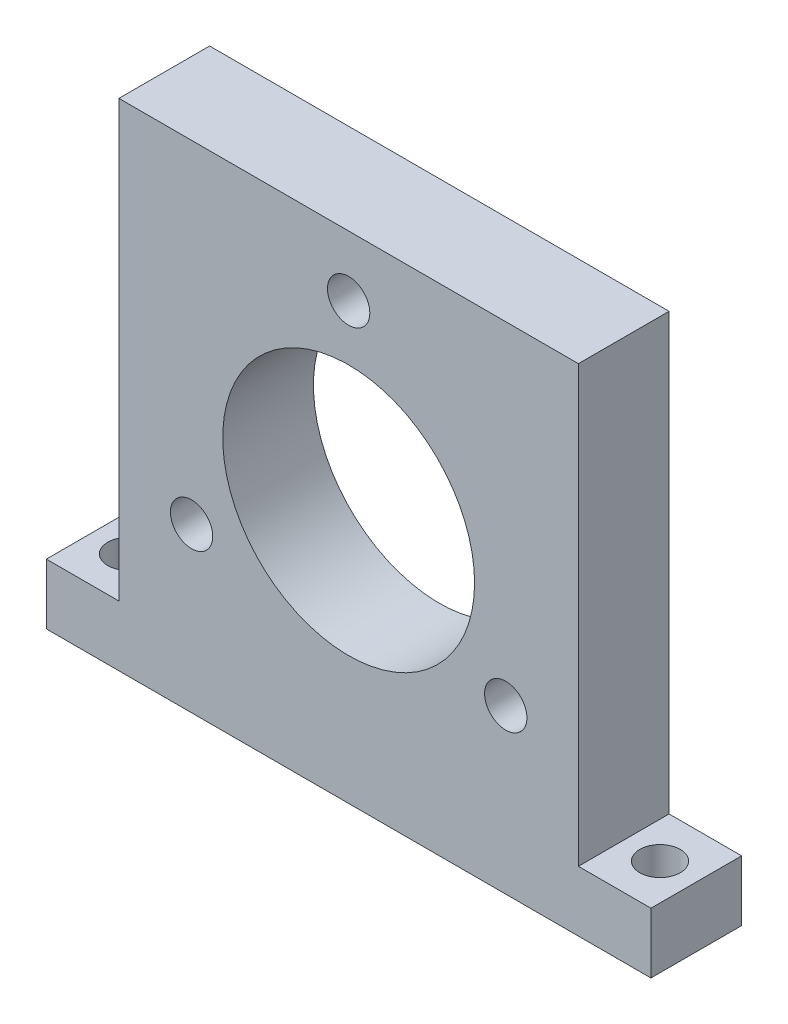
ISO-10303-21;
HEADER;
FILE_DESCRIPTION(('STEP AP214'),'2;1');
FILE_NAME('part.step','',(''),(''),'','','');
FILE_SCHEMA(('AUTOMOTIVE_DESIGN { 1 0 10303 214 1 1 1 1 }'));
ENDSEC;
DATA;
#1=APPLICATION_CONTEXT('core data for automotive mechanical design processes');
#2=APPLICATION_PROTOCOL_DEFINITION('international standard','automotive_design',2000,#1);
#3=PRODUCT_CONTEXT('',#1,'mechanical');
#4=PRODUCT('Part','Part','',(#3));
#5=PRODUCT_RELATED_PRODUCT_CATEGORY('part','',(#4));
#6=PRODUCT_DEFINITION_FORMATION('','',#4);
#7=PRODUCT_DEFINITION_CONTEXT('part definition',#1,'design');
#8=PRODUCT_DEFINITION('design','',#6,#7);
#9=PRODUCT_DEFINITION_SHAPE('','',#8);
#10=(LENGTH_UNIT() NAMED_UNIT(*) SI_UNIT(.MILLI.,.METRE.));
#11=(NAMED_UNIT(*) PLANE_ANGLE_UNIT() SI_UNIT($,.RADIAN.));
#12=(NAMED_UNIT(*) SI_UNIT($,.STERADIAN.) SOLID_ANGLE_UNIT());
#13=UNCERTAINTY_MEASURE_WITH_UNIT(LENGTH_MEASURE(1.E-05),#10,'distance_accuracy_value','');
#14=(GEOMETRIC_REPRESENTATION_CONTEXT(3) GLOBAL_UNCERTAINTY_ASSIGNED_CONTEXT((#13)) GLOBAL_UNIT_ASSIGNED_CONTEXT((#10,
#11,#12)) REPRESENTATION_CONTEXT('',''));
#15=CARTESIAN_POINT('',(0.,0.,0.));
#16=DIRECTION('',(0.,0.,1.));
#17=DIRECTION('',(1.,0.,0.));
#18=AXIS2_PLACEMENT_3D('',#15,#16,#17);
#19=CARTESIAN_POINT('',(19.,5.,-7.50000000000003));
#20=DIRECTION('',(1.,0.,0.));
#21=DIRECTION('',(0.,1.,0.));
#22=AXIS2_PLACEMENT_3D('',#19,#20,#21);
#23=PLANE('',#22);
#24=DIRECTION('',(0.,1.,0.));
#25=VECTOR('',#24,1.);
#26=CARTESIAN_POINT('',(19.,5.,0.));
#27=LINE('',#26,#25);
#28=CARTESIAN_POINT('',(19.,5.,0.));
#29=VERTEX_POINT('',#28);
#30=CARTESIAN_POINT('',(19.,41.,0.));
#31=VERTEX_POINT('',#30);
#32=EDGE_CURVE('E138',#29,#31,#27,.T.);
#33=ORIENTED_EDGE('',*,*,#32,.F.);
#34=DIRECTION('',(0.,0.,1.));
#35=VECTOR('',#34,1.);
#36=CARTESIAN_POINT('',(19.,5.,-7.50000000000003));
#37=LINE('',#36,#35);
#38=CARTESIAN_POINT('',(19.,5.,-7.50000000000003));
#39=VERTEX_POINT('',#38);
#40=EDGE_CURVE('E11',#39,#29,#37,.T.);
#41=ORIENTED_EDGE('',*,*,#40,.F.);
#42=DIRECTION('',(0.,1.,0.));
#43=VECTOR('',#42,1.);
#44=CARTESIAN_POINT('',(19.,5.,-7.50000000000003));
#45=LINE('',#44,#43);
#46=CARTESIAN_POINT('',(19.,41.,-7.50000000000003));
#47=VERTEX_POINT('',#46);
#48=EDGE_CURVE('E159',#39,#47,#45,.T.);
#49=ORIENTED_EDGE('',*,*,#48,.T.);
#50=DIRECTION('',(0.,0.,1.));
#51=VECTOR('',#50,1.);
#52=CARTESIAN_POINT('',(19.,41.,-7.50000000000003));
#53=LINE('',#52,#51);
#54=EDGE_CURVE('E44',#47,#31,#53,.T.);
#55=ORIENTED_EDGE('',*,*,#54,.T.);
#56=EDGE_LOOP('',(#33,#41,#49,#55));
#57=FACE_BOUND('',#56,.T.);
#58=ADVANCED_FACE('F41',(#57),#23,.T.);
#59=CARTESIAN_POINT('',(25.,5.,-7.50000000000001));
#60=DIRECTION('',(0.,1.,0.));
#61=DIRECTION('',(-1.,0.,0.));
#62=AXIS2_PLACEMENT_3D('',#59,#60,#61);
#63=PLANE('',#62);
#64=CARTESIAN_POINT('',(22.,5.,-3.75000000000004));
#65=DIRECTION('',(0.,1.,0.));
#66=DIRECTION('',(0.,0.,1.));
#67=AXIS2_PLACEMENT_3D('',#64,#65,#66);
#68=CIRCLE('',#67,1.675);
#69=CARTESIAN_POINT('',(22.,5.,-2.07500000000004));
#70=VERTEX_POINT('',#69);
#71=EDGE_CURVE('E240',#70,#70,#68,.T.);
#72=ORIENTED_EDGE('',*,*,#71,.F.);
#73=EDGE_LOOP('',(#72));
#74=FACE_BOUND('',#73,.T.);
#75=DIRECTION('',(-1.,0.,0.));
#76=VECTOR('',#75,1.);
#77=CARTESIAN_POINT('',(25.,5.,0.));
#78=LINE('',#77,#76);
#79=CARTESIAN_POINT('',(25.,5.,0.));
#80=VERTEX_POINT('',#79);
#81=EDGE_CURVE('E157',#80,#29,#78,.T.);
#82=ORIENTED_EDGE('',*,*,#81,.F.);
#83=DIRECTION('',(0.,0.,1.));
#84=VECTOR('',#83,1.);
#85=CARTESIAN_POINT('',(25.,5.,-7.50000000000001));
#86=LINE('',#85,#84);
#87=CARTESIAN_POINT('',(25.,5.,-7.50000000000001));
#88=VERTEX_POINT('',#87);
#89=EDGE_CURVE('E50',#88,#80,#86,.T.);
#90=ORIENTED_EDGE('',*,*,#89,.F.);
#91=DIRECTION('',(-1.,0.,0.));
#92=VECTOR('',#91,1.);
#93=CARTESIAN_POINT('',(25.,5.,-7.50000000000001));
#94=LINE('',#93,#92);
#95=EDGE_CURVE('E128',#88,#39,#94,.T.);
#96=ORIENTED_EDGE('',*,*,#95,.T.);
#97=ORIENTED_EDGE('',*,*,#40,.T.);
#98=EDGE_LOOP('',(#82,#90,#96,#97));
#99=FACE_BOUND('',#98,.T.);
#100=ADVANCED_FACE('F171',(#74,#99),#63,.T.);
#101=CARTESIAN_POINT('',(25.,0.,-7.50000000000002));
#102=DIRECTION('',(1.,0.,0.));
#103=DIRECTION('',(0.,0.,-1.));
#104=AXIS2_PLACEMENT_3D('',#101,#102,#103);
#105=PLANE('',#104);
#106=DIRECTION('',(0.,1.,0.));
#107=VECTOR('',#106,1.);
#108=CARTESIAN_POINT('',(25.,0.,0.));
#109=LINE('',#108,#107);
#110=CARTESIAN_POINT('',(25.,0.,0.));
#111=VERTEX_POINT('',#110);
#112=EDGE_CURVE('E115',#111,#80,#109,.T.);
#113=ORIENTED_EDGE('',*,*,#112,.F.);
#114=DIRECTION('',(0.,0.,1.));
#115=VECTOR('',#114,1.);
#116=CARTESIAN_POINT('',(25.,0.,-7.50000000000002));
#117=LINE('',#116,#115);
#118=CARTESIAN_POINT('',(25.,0.,-7.50000000000002));
#119=VERTEX_POINT('',#118);
#120=EDGE_CURVE('E110',#119,#111,#117,.T.);
#121=ORIENTED_EDGE('',*,*,#120,.F.);
#122=DIRECTION('',(0.,1.,0.));
#123=VECTOR('',#122,1.);
#124=CARTESIAN_POINT('',(25.,0.,-7.50000000000002));
#125=LINE('',#124,#123);
#126=EDGE_CURVE('E113',#119,#88,#125,.T.);
#127=ORIENTED_EDGE('',*,*,#126,.T.);
#128=ORIENTED_EDGE('',*,*,#89,.T.);
#129=EDGE_LOOP('',(#113,#121,#127,#128));
#130=FACE_BOUND('',#129,.T.);
#131=ADVANCED_FACE('F112',(#130),#105,.T.);
#132=CARTESIAN_POINT('',(-25.,0.,-7.50000000000001));
#133=DIRECTION('',(0.,-1.,0.));
#134=DIRECTION('',(0.,0.,-1.));
#135=AXIS2_PLACEMENT_3D('',#132,#133,#134);
#136=PLANE('',#135);
#137=CARTESIAN_POINT('',(22.,0.,-3.75000000000003));
#138=DIRECTION('',(0.,1.,0.));
#139=DIRECTION('',(0.,0.,1.));
#140=AXIS2_PLACEMENT_3D('',#137,#138,#139);
#141=CIRCLE('',#140,1.675);
#142=CARTESIAN_POINT('',(22.,0.,-2.07500000000003));
#143=VERTEX_POINT('',#142);
#144=EDGE_CURVE('E238',#143,#143,#141,.T.);
#145=ORIENTED_EDGE('',*,*,#144,.T.);
#146=EDGE_LOOP('',(#145));
#147=FACE_BOUND('',#146,.T.);
#148=CARTESIAN_POINT('',(-22.,0.,-3.75));
#149=DIRECTION('',(0.,1.,0.));
#150=DIRECTION('',(0.,0.,1.));
#151=AXIS2_PLACEMENT_3D('',#148,#149,#150);
#152=CIRCLE('',#151,1.675);
#153=CARTESIAN_POINT('',(-22.,0.,-2.075));
#154=VERTEX_POINT('',#153);
#155=EDGE_CURVE('E246',#154,#154,#152,.T.);
#156=ORIENTED_EDGE('',*,*,#155,.T.);
#157=EDGE_LOOP('',(#156));
#158=FACE_BOUND('',#157,.T.);
#159=DIRECTION('',(1.,0.,0.));
#160=VECTOR('',#159,1.);
#161=CARTESIAN_POINT('',(-25.,0.,0.));
#162=LINE('',#161,#160);
#163=CARTESIAN_POINT('',(-25.,0.,0.));
#164=VERTEX_POINT('',#163);
#165=EDGE_CURVE('E154',#164,#111,#162,.T.);
#166=ORIENTED_EDGE('',*,*,#165,.F.);
#167=DIRECTION('',(0.,0.,1.));
#168=VECTOR('',#167,1.);
#169=CARTESIAN_POINT('',(-25.,0.,-7.50000000000001));
#170=LINE('',#169,#168);
#171=CARTESIAN_POINT('',(-25.,0.,-7.50000000000001));
#172=VERTEX_POINT('',#171);
#173=EDGE_CURVE('E120',#172,#164,#170,.T.);
#174=ORIENTED_EDGE('',*,*,#173,.F.);
#175=DIRECTION('',(1.,0.,0.));
#176=VECTOR('',#175,1.);
#177=CARTESIAN_POINT('',(-25.,0.,-7.50000000000001));
#178=LINE('',#177,#176);
#179=EDGE_CURVE('E126',#172,#119,#178,.T.);
#180=ORIENTED_EDGE('',*,*,#179,.T.);
#181=ORIENTED_EDGE('',*,*,#120,.T.);
#182=EDGE_LOOP('',(#166,#174,#180,#181));
#183=FACE_BOUND('',#182,.T.);
#184=ADVANCED_FACE('F130',(#147,#158,#183),#136,.T.);
#185=CARTESIAN_POINT('',(-25.,4.99999999999995,-7.50000000000001));
#186=DIRECTION('',(-1.,0.,0.));
#187=DIRECTION('',(0.,0.,1.));
#188=AXIS2_PLACEMENT_3D('',#185,#186,#187);
#189=PLANE('',#188);
#190=DIRECTION('',(0.,-1.,0.));
#191=VECTOR('',#190,1.);
#192=CARTESIAN_POINT('',(-25.,5.,0.));
#193=LINE('',#192,#191);
#194=CARTESIAN_POINT('',(-25.,5.,0.));
#195=VERTEX_POINT('',#194);
#196=EDGE_CURVE('E151',#195,#164,#193,.T.);
#197=ORIENTED_EDGE('',*,*,#196,.F.);
#198=DIRECTION('',(0.,0.,1.));
#199=VECTOR('',#198,1.);
#200=CARTESIAN_POINT('',(-25.,4.99999999999995,-7.50000000000001));
#201=LINE('',#200,#199);
#202=CARTESIAN_POINT('',(-25.,4.99999999999995,-7.50000000000001));
#203=VERTEX_POINT('',#202);
#204=EDGE_CURVE('E163',#203,#195,#201,.T.);
#205=ORIENTED_EDGE('',*,*,#204,.F.);
#206=DIRECTION('',(0.,-1.,0.));
#207=VECTOR('',#206,1.);
#208=CARTESIAN_POINT('',(-25.,4.99999999999995,-7.50000000000001));
#209=LINE('',#208,#207);
#210=EDGE_CURVE('E131',#203,#172,#209,.T.);
#211=ORIENTED_EDGE('',*,*,#210,.T.);
#212=ORIENTED_EDGE('',*,*,#173,.T.);
#213=EDGE_LOOP('',(#197,#205,#211,#212));
#214=FACE_BOUND('',#213,.T.);
#215=ADVANCED_FACE('F186',(#214),#189,.T.);
#216=CARTESIAN_POINT('',(-19.,4.99999999999995,-7.50000000000002));
#217=DIRECTION('',(0.,1.,0.));
#218=DIRECTION('',(-1.,0.,0.));
#219=AXIS2_PLACEMENT_3D('',#216,#217,#218);
#220=PLANE('',#219);
#221=CARTESIAN_POINT('',(-22.,5.,-3.75000000000002));
#222=DIRECTION('',(0.,1.,0.));
#223=DIRECTION('',(0.,0.,1.));
#224=AXIS2_PLACEMENT_3D('',#221,#222,#223);
#225=CIRCLE('',#224,1.675);
#226=CARTESIAN_POINT('',(-22.,5.,-2.07500000000002));
#227=VERTEX_POINT('',#226);
#228=EDGE_CURVE('E241',#227,#227,#225,.T.);
#229=ORIENTED_EDGE('',*,*,#228,.F.);
#230=EDGE_LOOP('',(#229));
#231=FACE_BOUND('',#230,.T.);
#232=DIRECTION('',(-1.,0.,0.));
#233=VECTOR('',#232,1.);
#234=CARTESIAN_POINT('',(-19.,5.,0.));
#235=LINE('',#234,#233);
#236=CARTESIAN_POINT('',(-19.,5.,0.));
#237=VERTEX_POINT('',#236);
#238=EDGE_CURVE('E148',#237,#195,#235,.T.);
#239=ORIENTED_EDGE('',*,*,#238,.F.);
#240=DIRECTION('',(0.,0.,1.));
#241=VECTOR('',#240,1.);
#242=CARTESIAN_POINT('',(-19.,4.99999999999995,-7.50000000000002));
#243=LINE('',#242,#241);
#244=CARTESIAN_POINT('',(-19.,4.99999999999995,-7.50000000000002));
#245=VERTEX_POINT('',#244);
#246=EDGE_CURVE('E165',#245,#237,#243,.T.);
#247=ORIENTED_EDGE('',*,*,#246,.F.);
#248=DIRECTION('',(-1.,0.,0.));
#249=VECTOR('',#248,1.);
#250=CARTESIAN_POINT('',(-19.,4.99999999999995,-7.50000000000002));
#251=LINE('',#250,#249);
#252=EDGE_CURVE('E133',#245,#203,#251,.T.);
#253=ORIENTED_EDGE('',*,*,#252,.T.);
#254=ORIENTED_EDGE('',*,*,#204,.T.);
#255=EDGE_LOOP('',(#239,#247,#253,#254));
#256=FACE_BOUND('',#255,.T.);
#257=ADVANCED_FACE('F190',(#231,#256),#220,.T.);
#258=CARTESIAN_POINT('',(-19.,41.,-7.50000000000002));
#259=DIRECTION('',(-1.,0.,0.));
#260=DIRECTION('',(0.,-1.,0.));
#261=AXIS2_PLACEMENT_3D('',#258,#259,#260);
#262=PLANE('',#261);
#263=DIRECTION('',(0.,-1.,0.));
#264=VECTOR('',#263,1.);
#265=CARTESIAN_POINT('',(-19.,41.,0.));
#266=LINE('',#265,#264);
#267=CARTESIAN_POINT('',(-19.,41.,0.));
#268=VERTEX_POINT('',#267);
#269=EDGE_CURVE('E145',#268,#237,#266,.T.);
#270=ORIENTED_EDGE('',*,*,#269,.F.);
#271=DIRECTION('',(0.,0.,1.));
#272=VECTOR('',#271,1.);
#273=CARTESIAN_POINT('',(-19.,41.,-7.50000000000002));
#274=LINE('',#273,#272);
#275=CARTESIAN_POINT('',(-19.,41.,-7.50000000000002));
#276=VERTEX_POINT('',#275);
#277=EDGE_CURVE('E166',#276,#268,#274,.T.);
#278=ORIENTED_EDGE('',*,*,#277,.F.);
#279=DIRECTION('',(0.,-1.,0.));
#280=VECTOR('',#279,1.);
#281=CARTESIAN_POINT('',(-19.,41.,-7.50000000000002));
#282=LINE('',#281,#280);
#283=EDGE_CURVE('E275',#276,#245,#282,.T.);
#284=ORIENTED_EDGE('',*,*,#283,.T.);
#285=ORIENTED_EDGE('',*,*,#246,.T.);
#286=EDGE_LOOP('',(#270,#278,#284,#285));
#287=FACE_BOUND('',#286,.T.);
#288=ADVANCED_FACE('F194',(#287),#262,.T.);
#289=CARTESIAN_POINT('',(19.,41.,-7.50000000000003));
#290=DIRECTION('',(0.,1.,0.));
#291=DIRECTION('',(0.,0.,1.));
#292=AXIS2_PLACEMENT_3D('',#289,#290,#291);
#293=PLANE('',#292);
#294=DIRECTION('',(-1.,0.,0.));
#295=VECTOR('',#294,1.);
#296=CARTESIAN_POINT('',(19.,41.,0.));
#297=LINE('',#296,#295);
#298=EDGE_CURVE('E141',#31,#268,#297,.T.);
#299=ORIENTED_EDGE('',*,*,#298,.F.);
#300=ORIENTED_EDGE('',*,*,#54,.F.);
#301=DIRECTION('',(-1.,0.,0.));
#302=VECTOR('',#301,1.);
#303=CARTESIAN_POINT('',(19.,41.,-7.50000000000003));
#304=LINE('',#303,#302);
#305=EDGE_CURVE('E273',#47,#276,#304,.T.);
#306=ORIENTED_EDGE('',*,*,#305,.T.);
#307=ORIENTED_EDGE('',*,*,#277,.T.);
#308=EDGE_LOOP('',(#299,#300,#306,#307));
#309=FACE_BOUND('',#308,.T.);
#310=ADVANCED_FACE('F168',(#309),#293,.T.);
#311=CARTESIAN_POINT('',(0.,0.,-7.50000000000002));
#312=DIRECTION('',(0.,0.,1.));
#313=DIRECTION('',(1.,0.,0.));
#314=AXIS2_PLACEMENT_3D('',#311,#312,#313);
#315=PLANE('',#314);
#316=CARTESIAN_POINT('',(-12.9903810567665,13.4999999999999,-7.50000000000002));
#317=DIRECTION('',(0.,0.,1.));
#318=DIRECTION('',(-0.500000000000004,0.866025403784436,0.));
#319=AXIS2_PLACEMENT_3D('',#316,#317,#318);
#320=CIRCLE('',#319,1.75);
#321=CARTESIAN_POINT('',(-13.8653810567665,15.0155444566227,-7.50000000000002));
#322=VERTEX_POINT('',#321);
#323=EDGE_CURVE('E251',#322,#322,#320,.T.);
#324=ORIENTED_EDGE('',*,*,#323,.T.);
#325=EDGE_LOOP('',(#324));
#326=FACE_BOUND('',#325,.T.);
#327=CARTESIAN_POINT('',(12.9903810567667,13.5000000000001,-7.50000000000002));
#328=DIRECTION('',(0.,0.,1.));
#329=DIRECTION('',(-0.499999999999992,-0.866025403784443,0.));
#330=AXIS2_PLACEMENT_3D('',#327,#328,#329);
#331=CIRCLE('',#330,1.75);
#332=CARTESIAN_POINT('',(12.1153810567667,11.9844555433773,-7.50000000000002));
#333=VERTEX_POINT('',#332);
#334=EDGE_CURVE('E257',#333,#333,#331,.T.);
#335=ORIENTED_EDGE('',*,*,#334,.T.);
#336=EDGE_LOOP('',(#335));
#337=FACE_BOUND('',#336,.T.);
#338=CARTESIAN_POINT('',(0.,36.,-7.50000000000001));
#339=DIRECTION('',(0.,0.,1.));
#340=DIRECTION('',(1.,0.,0.));
#341=AXIS2_PLACEMENT_3D('',#338,#339,#340);
#342=CIRCLE('',#341,1.75);
#343=CARTESIAN_POINT('',(1.75000000000001,36.,-7.50000000000001));
#344=VERTEX_POINT('',#343);
#345=EDGE_CURVE('E262',#344,#344,#342,.T.);
#346=ORIENTED_EDGE('',*,*,#345,.T.);
#347=EDGE_LOOP('',(#346));
#348=FACE_BOUND('',#347,.T.);
#349=CARTESIAN_POINT('',(0.,20.9999999999999,-7.50000000000001));
#350=DIRECTION('',(0.,0.,1.));
#351=DIRECTION('',(1.,0.,0.));
#352=AXIS2_PLACEMENT_3D('',#349,#350,#351);
#353=CIRCLE('',#352,10.414);
#354=CARTESIAN_POINT('',(10.414,20.9999999999999,-7.50000000000001));
#355=VERTEX_POINT('',#354);
#356=EDGE_CURVE('E142',#355,#355,#353,.T.);
#357=ORIENTED_EDGE('',*,*,#356,.T.);
#358=EDGE_LOOP('',(#357));
#359=FACE_BOUND('',#358,.T.);
#360=ORIENTED_EDGE('',*,*,#48,.F.);
#361=ORIENTED_EDGE('',*,*,#95,.F.);
#362=ORIENTED_EDGE('',*,*,#126,.F.);
#363=ORIENTED_EDGE('',*,*,#179,.F.);
#364=ORIENTED_EDGE('',*,*,#210,.F.);
#365=ORIENTED_EDGE('',*,*,#252,.F.);
#366=ORIENTED_EDGE('',*,*,#283,.F.);
#367=ORIENTED_EDGE('',*,*,#305,.F.);
#368=EDGE_LOOP('',(#360,#361,#362,#363,#364,#365,#366,#367));
#369=FACE_BOUND('',#368,.T.);
#370=ADVANCED_FACE('F124',(#326,#337,#348,#359,#369),#315,.F.);
#371=CARTESIAN_POINT('',(0.,0.,0.));
#372=DIRECTION('',(0.,0.,1.));
#373=DIRECTION('',(1.,0.,0.));
#374=AXIS2_PLACEMENT_3D('',#371,#372,#373);
#375=PLANE('',#374);
#376=CARTESIAN_POINT('',(-12.9903810567665,13.4999999999999,0.));
#377=DIRECTION('',(0.,0.,1.));
#378=DIRECTION('',(-0.500000000000004,0.866025403784436,0.));
#379=AXIS2_PLACEMENT_3D('',#376,#377,#378);
#380=CIRCLE('',#379,1.75);
#381=CARTESIAN_POINT('',(-13.8653810567665,15.0155444566227,0.));
#382=VERTEX_POINT('',#381);
#383=EDGE_CURVE('E254',#382,#382,#380,.T.);
#384=ORIENTED_EDGE('',*,*,#383,.F.);
#385=EDGE_LOOP('',(#384));
#386=FACE_BOUND('',#385,.T.);
#387=CARTESIAN_POINT('',(12.9903810567667,13.5000000000001,0.));
#388=DIRECTION('',(0.,0.,1.));
#389=DIRECTION('',(-0.499999999999992,-0.866025403784443,0.));
#390=AXIS2_PLACEMENT_3D('',#387,#388,#389);
#391=CIRCLE('',#390,1.75);
#392=CARTESIAN_POINT('',(12.1153810567667,11.9844555433773,0.));
#393=VERTEX_POINT('',#392);
#394=EDGE_CURVE('E243',#393,#393,#391,.T.);
#395=ORIENTED_EDGE('',*,*,#394,.F.);
#396=EDGE_LOOP('',(#395));
#397=FACE_BOUND('',#396,.T.);
#398=CARTESIAN_POINT('',(0.,36.,0.));
#399=DIRECTION('',(0.,0.,1.));
#400=DIRECTION('',(1.,0.,0.));
#401=AXIS2_PLACEMENT_3D('',#398,#399,#400);
#402=CIRCLE('',#401,1.75);
#403=CARTESIAN_POINT('',(1.75,36.,0.));
#404=VERTEX_POINT('',#403);
#405=EDGE_CURVE('E253',#404,#404,#402,.T.);
#406=ORIENTED_EDGE('',*,*,#405,.F.);
#407=EDGE_LOOP('',(#406));
#408=FACE_BOUND('',#407,.T.);
#409=CARTESIAN_POINT('',(0.,21.,0.));
#410=DIRECTION('',(0.,0.,1.));
#411=DIRECTION('',(1.,0.,0.));
#412=AXIS2_PLACEMENT_3D('',#409,#410,#411);
#413=CIRCLE('',#412,10.414);
#414=CARTESIAN_POINT('',(10.414,21.,0.));
#415=VERTEX_POINT('',#414);
#416=EDGE_CURVE('E265',#415,#415,#413,.T.);
#417=ORIENTED_EDGE('',*,*,#416,.F.);
#418=EDGE_LOOP('',(#417));
#419=FACE_BOUND('',#418,.T.);
#420=ORIENTED_EDGE('',*,*,#32,.T.);
#421=ORIENTED_EDGE('',*,*,#298,.T.);
#422=ORIENTED_EDGE('',*,*,#269,.T.);
#423=ORIENTED_EDGE('',*,*,#238,.T.);
#424=ORIENTED_EDGE('',*,*,#196,.T.);
#425=ORIENTED_EDGE('',*,*,#165,.T.);
#426=ORIENTED_EDGE('',*,*,#112,.T.);
#427=ORIENTED_EDGE('',*,*,#81,.T.);
#428=EDGE_LOOP('',(#420,#421,#422,#423,#424,#425,#426,#427));
#429=FACE_BOUND('',#428,.T.);
#430=ADVANCED_FACE('F170',(#386,#397,#408,#419,#429),#375,.T.);
#431=CARTESIAN_POINT('',(0.,20.9999999999999,-7.50000000000001));
#432=DIRECTION('',(0.,0.,1.));
#433=DIRECTION('',(1.,0.,0.));
#434=AXIS2_PLACEMENT_3D('',#431,#432,#433);
#435=CYLINDRICAL_SURFACE('',#434,10.414);
#436=ORIENTED_EDGE('',*,*,#356,.F.);
#437=EDGE_LOOP('',(#436));
#438=FACE_BOUND('',#437,.T.);
#439=ORIENTED_EDGE('',*,*,#416,.T.);
#440=EDGE_LOOP('',(#439));
#441=FACE_BOUND('',#440,.T.);
#442=ADVANCED_FACE('F206',(#438,#441),#435,.F.);
#443=CARTESIAN_POINT('',(0.,36.,-7.50000000000001));
#444=DIRECTION('',(0.,0.,1.));
#445=DIRECTION('',(1.,0.,0.));
#446=AXIS2_PLACEMENT_3D('',#443,#444,#445);
#447=CYLINDRICAL_SURFACE('',#446,1.75);
#448=ORIENTED_EDGE('',*,*,#345,.F.);
#449=EDGE_LOOP('',(#448));
#450=FACE_BOUND('',#449,.T.);
#451=ORIENTED_EDGE('',*,*,#405,.T.);
#452=EDGE_LOOP('',(#451));
#453=FACE_BOUND('',#452,.T.);
#454=ADVANCED_FACE('F213',(#450,#453),#447,.F.);
#455=CARTESIAN_POINT('',(12.9903810567667,13.5000000000001,-7.50000000000002));
#456=DIRECTION('',(0.,0.,1.));
#457=DIRECTION('',(1.,0.,0.));
#458=AXIS2_PLACEMENT_3D('',#455,#456,#457);
#459=CYLINDRICAL_SURFACE('',#458,1.75);
#460=ORIENTED_EDGE('',*,*,#334,.F.);
#461=EDGE_LOOP('',(#460));
#462=FACE_BOUND('',#461,.T.);
#463=ORIENTED_EDGE('',*,*,#394,.T.);
#464=EDGE_LOOP('',(#463));
#465=FACE_BOUND('',#464,.T.);
#466=ADVANCED_FACE('F217',(#462,#465),#459,.F.);
#467=CARTESIAN_POINT('',(-12.9903810567665,13.4999999999999,-7.50000000000002));
#468=DIRECTION('',(0.,0.,1.));
#469=DIRECTION('',(1.,0.,0.));
#470=AXIS2_PLACEMENT_3D('',#467,#468,#469);
#471=CYLINDRICAL_SURFACE('',#470,1.75);
#472=ORIENTED_EDGE('',*,*,#323,.F.);
#473=EDGE_LOOP('',(#472));
#474=FACE_BOUND('',#473,.T.);
#475=ORIENTED_EDGE('',*,*,#383,.T.);
#476=EDGE_LOOP('',(#475));
#477=FACE_BOUND('',#476,.T.);
#478=ADVANCED_FACE('F221',(#474,#477),#471,.F.);
#479=CARTESIAN_POINT('',(-22.,0.,-3.75));
#480=DIRECTION('',(0.,1.,0.));
#481=DIRECTION('',(0.,0.,1.));
#482=AXIS2_PLACEMENT_3D('',#479,#480,#481);
#483=CYLINDRICAL_SURFACE('',#482,1.675);
#484=ORIENTED_EDGE('',*,*,#155,.F.);
#485=EDGE_LOOP('',(#484));
#486=FACE_BOUND('',#485,.T.);
#487=ORIENTED_EDGE('',*,*,#228,.T.);
#488=EDGE_LOOP('',(#487));
#489=FACE_BOUND('',#488,.T.);
#490=ADVANCED_FACE('F225',(#486,#489),#483,.F.);
#491=CARTESIAN_POINT('',(22.,0.,-3.75000000000003));
#492=DIRECTION('',(0.,1.,0.));
#493=DIRECTION('',(0.,0.,1.));
#494=AXIS2_PLACEMENT_3D('',#491,#492,#493);
#495=CYLINDRICAL_SURFACE('',#494,1.675);
#496=ORIENTED_EDGE('',*,*,#144,.F.);
#497=EDGE_LOOP('',(#496));
#498=FACE_BOUND('',#497,.T.);
#499=ORIENTED_EDGE('',*,*,#71,.T.);
#500=EDGE_LOOP('',(#499));
#501=FACE_BOUND('',#500,.T.);
#502=ADVANCED_FACE('F229',(#498,#501),#495,.F.);
#503=CLOSED_SHELL('',(#58,#100,#131,#184,#215,#257,#288,#310,#370,#430,#442,#454,#466,#478,#490,#502));
#504=MANIFOLD_SOLID_BREP('B2',#503);
#505=ADVANCED_BREP_SHAPE_REPRESENTATION('',(#18,#504),#14);
#506=SHAPE_DEFINITION_REPRESENTATION(#9,#505);
ENDSEC;
END-ISO-10303-21;
